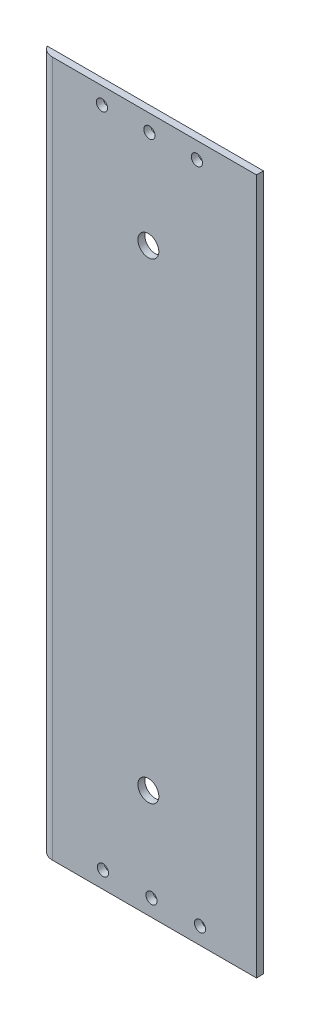
ISO-10303-21;
HEADER;
FILE_DESCRIPTION(('STEP AP214'),'2;1');
FILE_NAME('part.step','',(''),(''),'','','');
FILE_SCHEMA(('AUTOMOTIVE_DESIGN { 1 0 10303 214 1 1 1 1 }'));
ENDSEC;
DATA;
#1=APPLICATION_CONTEXT('core data for automotive mechanical design processes');
#2=APPLICATION_PROTOCOL_DEFINITION('international standard','automotive_design',2000,#1);
#3=PRODUCT_CONTEXT('',#1,'mechanical');
#4=PRODUCT('Part','Part','',(#3));
#5=PRODUCT_RELATED_PRODUCT_CATEGORY('part','',(#4));
#6=PRODUCT_DEFINITION_FORMATION('','',#4);
#7=PRODUCT_DEFINITION_CONTEXT('part definition',#1,'design');
#8=PRODUCT_DEFINITION('design','',#6,#7);
#9=PRODUCT_DEFINITION_SHAPE('','',#8);
#10=(LENGTH_UNIT() NAMED_UNIT(*) SI_UNIT(.MILLI.,.METRE.));
#11=(NAMED_UNIT(*) PLANE_ANGLE_UNIT() SI_UNIT($,.RADIAN.));
#12=(NAMED_UNIT(*) SI_UNIT($,.STERADIAN.) SOLID_ANGLE_UNIT());
#13=UNCERTAINTY_MEASURE_WITH_UNIT(LENGTH_MEASURE(1.E-05),#10,'distance_accuracy_value','');
#14=(GEOMETRIC_REPRESENTATION_CONTEXT(3) GLOBAL_UNCERTAINTY_ASSIGNED_CONTEXT((#13)) GLOBAL_UNIT_ASSIGNED_CONTEXT((#10,
#11,#12)) REPRESENTATION_CONTEXT('',''));
#15=CARTESIAN_POINT('',(0.,0.,0.));
#16=DIRECTION('',(0.,0.,1.));
#17=DIRECTION('',(1.,0.,0.));
#18=AXIS2_PLACEMENT_3D('',#15,#16,#17);
#19=CARTESIAN_POINT('',(-155.,-445.030563372544,5.));
#20=DIRECTION('',(0.,1.,0.));
#21=DIRECTION('',(0.,0.,1.));
#22=AXIS2_PLACEMENT_3D('',#19,#20,#21);
#23=PLANE('',#22);
#24=DIRECTION('',(1.,0.,0.));
#25=VECTOR('',#24,1.);
#26=CARTESIAN_POINT('',(-155.,-445.030563372544,5.));
#27=LINE('',#26,#25);
#28=CARTESIAN_POINT('',(-146.339745962156,-445.030563372544,5.));
#29=VERTEX_POINT('',#28);
#30=CARTESIAN_POINT('',(0.,-445.030563372544,5.));
#31=VERTEX_POINT('',#30);
#32=EDGE_CURVE('E75',#29,#31,#27,.T.);
#33=ORIENTED_EDGE('',*,*,#32,.F.);
#34=CARTESIAN_POINT('',(-146.339745962156,-445.030563372544,-5.));
#35=DIRECTION('',(0.,1.,0.));
#36=DIRECTION('',(0.,0.,1.));
#37=AXIS2_PLACEMENT_3D('',#34,#35,#36);
#38=CIRCLE('',#37,10.);
#39=CARTESIAN_POINT('',(-155.,-445.030563372544,0.));
#40=VERTEX_POINT('',#39);
#41=EDGE_CURVE('E44',#29,#40,#38,.F.);
#42=ORIENTED_EDGE('',*,*,#41,.T.);
#43=DIRECTION('',(1.,0.,0.));
#44=VECTOR('',#43,1.);
#45=CARTESIAN_POINT('',(-155.,-445.030563372544,0.));
#46=LINE('',#45,#44);
#47=CARTESIAN_POINT('',(0.,-445.030563372544,0.));
#48=VERTEX_POINT('',#47);
#49=EDGE_CURVE('E88',#40,#48,#46,.T.);
#50=ORIENTED_EDGE('',*,*,#49,.T.);
#51=DIRECTION('',(0.,0.,-1.));
#52=VECTOR('',#51,1.);
#53=CARTESIAN_POINT('',(0.,-445.030563372544,5.));
#54=LINE('',#53,#52);
#55=EDGE_CURVE('E86',#31,#48,#54,.T.);
#56=ORIENTED_EDGE('',*,*,#55,.F.);
#57=EDGE_LOOP('',(#33,#42,#50,#56));
#58=FACE_BOUND('',#57,.T.);
#59=ADVANCED_FACE('F36',(#58),#23,.F.);
#60=CARTESIAN_POINT('',(0.,-445.030563372544,5.));
#61=DIRECTION('',(-1.,0.,0.));
#62=DIRECTION('',(0.,-1.,0.));
#63=AXIS2_PLACEMENT_3D('',#60,#61,#62);
#64=PLANE('',#63);
#65=DIRECTION('',(0.,1.,0.));
#66=VECTOR('',#65,1.);
#67=CARTESIAN_POINT('',(0.,-445.030563372544,0.));
#68=LINE('',#67,#66);
#69=CARTESIAN_POINT('',(0.,53.496236627456,0.));
#70=VERTEX_POINT('',#69);
#71=EDGE_CURVE('E104',#48,#70,#68,.T.);
#72=ORIENTED_EDGE('',*,*,#71,.T.);
#73=DIRECTION('',(0.,0.,-1.));
#74=VECTOR('',#73,1.);
#75=CARTESIAN_POINT('',(0.,53.496236627456,5.));
#76=LINE('',#75,#74);
#77=CARTESIAN_POINT('',(0.,53.496236627456,5.));
#78=VERTEX_POINT('',#77);
#79=EDGE_CURVE('E91',#78,#70,#76,.T.);
#80=ORIENTED_EDGE('',*,*,#79,.F.);
#81=DIRECTION('',(0.,1.,0.));
#82=VECTOR('',#81,1.);
#83=CARTESIAN_POINT('',(0.,-445.030563372544,5.));
#84=LINE('',#83,#82);
#85=EDGE_CURVE('E79',#31,#78,#84,.T.);
#86=ORIENTED_EDGE('',*,*,#85,.F.);
#87=ORIENTED_EDGE('',*,*,#55,.T.);
#88=EDGE_LOOP('',(#72,#80,#86,#87));
#89=FACE_BOUND('',#88,.T.);
#90=ADVANCED_FACE('F93',(#89),#64,.F.);
#91=CARTESIAN_POINT('',(-155.,53.496236627456,5.));
#92=DIRECTION('',(0.,-1.,0.));
#93=DIRECTION('',(0.,0.,-1.));
#94=AXIS2_PLACEMENT_3D('',#91,#92,#93);
#95=PLANE('',#94);
#96=DIRECTION('',(-1.,0.,0.));
#97=VECTOR('',#96,1.);
#98=CARTESIAN_POINT('',(-155.,53.496236627456,0.));
#99=LINE('',#98,#97);
#100=CARTESIAN_POINT('',(-155.,53.496236627456,0.));
#101=VERTEX_POINT('',#100);
#102=EDGE_CURVE('E83',#70,#101,#99,.T.);
#103=ORIENTED_EDGE('',*,*,#102,.T.);
#104=CARTESIAN_POINT('',(-146.339745962156,53.496236627456,-5.));
#105=DIRECTION('',(0.,-1.,0.));
#106=DIRECTION('',(0.,0.,-1.));
#107=AXIS2_PLACEMENT_3D('',#104,#105,#106);
#108=CIRCLE('',#107,10.);
#109=CARTESIAN_POINT('',(-146.339745962156,53.496236627456,5.));
#110=VERTEX_POINT('',#109);
#111=EDGE_CURVE('E12',#101,#110,#108,.F.);
#112=ORIENTED_EDGE('',*,*,#111,.T.);
#113=DIRECTION('',(-1.,0.,0.));
#114=VECTOR('',#113,1.);
#115=CARTESIAN_POINT('',(-155.,53.496236627456,5.));
#116=LINE('',#115,#114);
#117=EDGE_CURVE('E95',#78,#110,#116,.T.);
#118=ORIENTED_EDGE('',*,*,#117,.F.);
#119=ORIENTED_EDGE('',*,*,#79,.T.);
#120=EDGE_LOOP('',(#103,#112,#118,#119));
#121=FACE_BOUND('',#120,.T.);
#122=ADVANCED_FACE('F124',(#121),#95,.F.);
#123=CARTESIAN_POINT('',(0.,0.,5.));
#124=DIRECTION('',(0.,0.,-1.));
#125=DIRECTION('',(-1.,0.,0.));
#126=AXIS2_PLACEMENT_3D('',#123,#124,#125);
#127=PLANE('',#126);
#128=CARTESIAN_POINT('',(-110.784394877579,41.4712366274554,5.));
#129=DIRECTION('',(0.,0.,1.));
#130=DIRECTION('',(1.,0.,0.));
#131=AXIS2_PLACEMENT_3D('',#128,#129,#130);
#132=CIRCLE('',#131,4.00000000000001);
#133=CARTESIAN_POINT('',(-106.784394877579,41.4712366274554,5.));
#134=VERTEX_POINT('',#133);
#135=EDGE_CURVE('E196',#134,#134,#132,.T.);
#136=ORIENTED_EDGE('',*,*,#135,.F.);
#137=EDGE_LOOP('',(#136));
#138=FACE_BOUND('',#137,.T.);
#139=CARTESIAN_POINT('',(-76.7483948775787,41.4712366274555,5.));
#140=DIRECTION('',(0.,0.,1.));
#141=DIRECTION('',(1.,0.,0.));
#142=AXIS2_PLACEMENT_3D('',#139,#140,#141);
#143=CIRCLE('',#142,4.00000000000001);
#144=CARTESIAN_POINT('',(-72.7483948775787,41.4712366274555,5.));
#145=VERTEX_POINT('',#144);
#146=EDGE_CURVE('E190',#145,#145,#143,.T.);
#147=ORIENTED_EDGE('',*,*,#146,.F.);
#148=EDGE_LOOP('',(#147));
#149=FACE_BOUND('',#148,.T.);
#150=CARTESIAN_POINT('',(-42.7123948775787,41.4712366274555,5.));
#151=DIRECTION('',(0.,0.,1.));
#152=DIRECTION('',(1.,0.,0.));
#153=AXIS2_PLACEMENT_3D('',#150,#151,#152);
#154=CIRCLE('',#153,4.);
#155=CARTESIAN_POINT('',(-38.7123948775787,41.4712366274555,5.));
#156=VERTEX_POINT('',#155);
#157=EDGE_CURVE('E184',#156,#156,#154,.T.);
#158=ORIENTED_EDGE('',*,*,#157,.F.);
#159=EDGE_LOOP('',(#158));
#160=FACE_BOUND('',#159,.T.);
#161=CARTESIAN_POINT('',(-40.4743948775786,-433.005563372545,5.));
#162=DIRECTION('',(0.,0.,1.));
#163=DIRECTION('',(1.,0.,0.));
#164=AXIS2_PLACEMENT_3D('',#161,#162,#163);
#165=CIRCLE('',#164,4.);
#166=CARTESIAN_POINT('',(-36.4743948775786,-433.005563372545,5.));
#167=VERTEX_POINT('',#166);
#168=EDGE_CURVE('E176',#167,#167,#165,.T.);
#169=ORIENTED_EDGE('',*,*,#168,.F.);
#170=EDGE_LOOP('',(#169));
#171=FACE_BOUND('',#170,.T.);
#172=CARTESIAN_POINT('',(-75.2723948775786,-433.005563372544,5.));
#173=DIRECTION('',(0.,0.,1.));
#174=DIRECTION('',(1.,0.,0.));
#175=AXIS2_PLACEMENT_3D('',#172,#173,#174);
#176=CIRCLE('',#175,4.00000000000001);
#177=CARTESIAN_POINT('',(-71.2723948775786,-433.005563372544,5.));
#178=VERTEX_POINT('',#177);
#179=EDGE_CURVE('E169',#178,#178,#176,.T.);
#180=ORIENTED_EDGE('',*,*,#179,.F.);
#181=EDGE_LOOP('',(#180));
#182=FACE_BOUND('',#181,.T.);
#183=CARTESIAN_POINT('',(-110.070394877579,-433.005563372544,5.));
#184=DIRECTION('',(0.,0.,1.));
#185=DIRECTION('',(1.,0.,0.));
#186=AXIS2_PLACEMENT_3D('',#183,#184,#185);
#187=CIRCLE('',#186,4.00000000000001);
#188=CARTESIAN_POINT('',(-106.070394877579,-433.005563372544,5.));
#189=VERTEX_POINT('',#188);
#190=EDGE_CURVE('E174',#189,#189,#187,.T.);
#191=ORIENTED_EDGE('',*,*,#190,.F.);
#192=EDGE_LOOP('',(#191));
#193=FACE_BOUND('',#192,.T.);
#194=CARTESIAN_POINT('',(-77.5000000000002,-367.367664241042,5.));
#195=DIRECTION('',(0.,0.,1.));
#196=DIRECTION('',(1.,0.,0.));
#197=AXIS2_PLACEMENT_3D('',#194,#195,#196);
#198=CIRCLE('',#197,7.50000000000001);
#199=CARTESIAN_POINT('',(-70.0000000000002,-367.367664241042,5.));
#200=VERTEX_POINT('',#199);
#201=EDGE_CURVE('E102',#200,#200,#198,.T.);
#202=ORIENTED_EDGE('',*,*,#201,.F.);
#203=EDGE_LOOP('',(#202));
#204=FACE_BOUND('',#203,.T.);
#205=CARTESIAN_POINT('',(-77.5000000000002,-29.1666625040467,5.));
#206=DIRECTION('',(0.,0.,1.));
#207=DIRECTION('',(1.,0.,0.));
#208=AXIS2_PLACEMENT_3D('',#205,#206,#207);
#209=CIRCLE('',#208,7.50000000000001);
#210=CARTESIAN_POINT('',(-70.0000000000002,-29.1666625040467,5.));
#211=VERTEX_POINT('',#210);
#212=EDGE_CURVE('E210',#211,#211,#209,.T.);
#213=ORIENTED_EDGE('',*,*,#212,.F.);
#214=EDGE_LOOP('',(#213));
#215=FACE_BOUND('',#214,.T.);
#216=ORIENTED_EDGE('',*,*,#117,.T.);
#217=DIRECTION('',(0.,1.,0.));
#218=VECTOR('',#217,1.);
#219=CARTESIAN_POINT('',(-146.339745962156,0.,5.));
#220=LINE('',#219,#218);
#221=EDGE_CURVE('E81',#110,#29,#220,.F.);
#222=ORIENTED_EDGE('',*,*,#221,.T.);
#223=ORIENTED_EDGE('',*,*,#32,.T.);
#224=ORIENTED_EDGE('',*,*,#85,.T.);
#225=EDGE_LOOP('',(#216,#222,#223,#224));
#226=FACE_BOUND('',#225,.T.);
#227=ADVANCED_FACE('F77',(#138,#149,#160,#171,#182,#193,#204,#215,#226),#127,.F.);
#228=CARTESIAN_POINT('',(0.,0.,0.));
#229=DIRECTION('',(0.,0.,-1.));
#230=DIRECTION('',(-1.,0.,0.));
#231=AXIS2_PLACEMENT_3D('',#228,#229,#230);
#232=PLANE('',#231);
#233=CARTESIAN_POINT('',(-110.784394877579,41.4712366274554,0.));
#234=DIRECTION('',(0.,0.,-1.));
#235=DIRECTION('',(-1.,0.,0.));
#236=AXIS2_PLACEMENT_3D('',#233,#234,#235);
#237=CIRCLE('',#236,4.00000000000001);
#238=CARTESIAN_POINT('',(-114.784394877579,41.4712366274554,0.));
#239=VERTEX_POINT('',#238);
#240=EDGE_CURVE('E199',#239,#239,#237,.F.);
#241=ORIENTED_EDGE('',*,*,#240,.T.);
#242=EDGE_LOOP('',(#241));
#243=FACE_BOUND('',#242,.T.);
#244=CARTESIAN_POINT('',(-76.7483948775787,41.4712366274555,0.));
#245=DIRECTION('',(0.,0.,-1.));
#246=DIRECTION('',(-1.,0.,0.));
#247=AXIS2_PLACEMENT_3D('',#244,#245,#246);
#248=CIRCLE('',#247,4.00000000000001);
#249=CARTESIAN_POINT('',(-80.7483948775787,41.4712366274555,0.));
#250=VERTEX_POINT('',#249);
#251=EDGE_CURVE('E193',#250,#250,#248,.F.);
#252=ORIENTED_EDGE('',*,*,#251,.T.);
#253=EDGE_LOOP('',(#252));
#254=FACE_BOUND('',#253,.T.);
#255=CARTESIAN_POINT('',(-42.7123948775787,41.4712366274555,0.));
#256=DIRECTION('',(0.,0.,-1.));
#257=DIRECTION('',(-1.,0.,0.));
#258=AXIS2_PLACEMENT_3D('',#255,#256,#257);
#259=CIRCLE('',#258,4.);
#260=CARTESIAN_POINT('',(-46.7123948775787,41.4712366274555,0.));
#261=VERTEX_POINT('',#260);
#262=EDGE_CURVE('E187',#261,#261,#259,.F.);
#263=ORIENTED_EDGE('',*,*,#262,.T.);
#264=EDGE_LOOP('',(#263));
#265=FACE_BOUND('',#264,.T.);
#266=CARTESIAN_POINT('',(-40.4743948775786,-433.005563372545,0.));
#267=DIRECTION('',(0.,0.,-1.));
#268=DIRECTION('',(-1.,0.,0.));
#269=AXIS2_PLACEMENT_3D('',#266,#267,#268);
#270=CIRCLE('',#269,4.);
#271=CARTESIAN_POINT('',(-44.4743948775786,-433.005563372545,0.));
#272=VERTEX_POINT('',#271);
#273=EDGE_CURVE('E181',#272,#272,#270,.F.);
#274=ORIENTED_EDGE('',*,*,#273,.T.);
#275=EDGE_LOOP('',(#274));
#276=FACE_BOUND('',#275,.T.);
#277=CARTESIAN_POINT('',(-75.2723948775786,-433.005563372544,0.));
#278=DIRECTION('',(0.,0.,-1.));
#279=DIRECTION('',(-1.,0.,0.));
#280=AXIS2_PLACEMENT_3D('',#277,#278,#279);
#281=CIRCLE('',#280,4.00000000000001);
#282=CARTESIAN_POINT('',(-79.2723948775786,-433.005563372544,0.));
#283=VERTEX_POINT('',#282);
#284=EDGE_CURVE('E166',#283,#283,#281,.F.);
#285=ORIENTED_EDGE('',*,*,#284,.T.);
#286=EDGE_LOOP('',(#285));
#287=FACE_BOUND('',#286,.T.);
#288=CARTESIAN_POINT('',(-110.070394877579,-433.005563372544,0.));
#289=DIRECTION('',(0.,0.,-1.));
#290=DIRECTION('',(-1.,0.,0.));
#291=AXIS2_PLACEMENT_3D('',#288,#289,#290);
#292=CIRCLE('',#291,4.00000000000001);
#293=CARTESIAN_POINT('',(-114.070394877579,-433.005563372544,0.));
#294=VERTEX_POINT('',#293);
#295=EDGE_CURVE('E171',#294,#294,#292,.F.);
#296=ORIENTED_EDGE('',*,*,#295,.T.);
#297=EDGE_LOOP('',(#296));
#298=FACE_BOUND('',#297,.T.);
#299=CARTESIAN_POINT('',(-77.5000000000002,-367.367664241042,0.));
#300=DIRECTION('',(0.,0.,-1.));
#301=DIRECTION('',(-1.,0.,0.));
#302=AXIS2_PLACEMENT_3D('',#299,#300,#301);
#303=CIRCLE('',#302,7.50000000000001);
#304=CARTESIAN_POINT('',(-85.0000000000002,-367.367664241042,0.));
#305=VERTEX_POINT('',#304);
#306=EDGE_CURVE('E207',#305,#305,#303,.F.);
#307=ORIENTED_EDGE('',*,*,#306,.T.);
#308=EDGE_LOOP('',(#307));
#309=FACE_BOUND('',#308,.T.);
#310=CARTESIAN_POINT('',(-77.5000000000002,-29.1666625040467,0.));
#311=DIRECTION('',(0.,0.,-1.));
#312=DIRECTION('',(-1.,0.,0.));
#313=AXIS2_PLACEMENT_3D('',#310,#311,#312);
#314=CIRCLE('',#313,7.50000000000001);
#315=CARTESIAN_POINT('',(-85.0000000000002,-29.1666625040467,0.));
#316=VERTEX_POINT('',#315);
#317=EDGE_CURVE('E203',#316,#316,#314,.F.);
#318=ORIENTED_EDGE('',*,*,#317,.T.);
#319=EDGE_LOOP('',(#318));
#320=FACE_BOUND('',#319,.T.);
#321=DIRECTION('',(0.,-1.,0.));
#322=VECTOR('',#321,1.);
#323=CARTESIAN_POINT('',(-155.,-445.030563372544,0.));
#324=LINE('',#323,#322);
#325=EDGE_CURVE('E100',#101,#40,#324,.T.);
#326=ORIENTED_EDGE('',*,*,#325,.F.);
#327=ORIENTED_EDGE('',*,*,#102,.F.);
#328=ORIENTED_EDGE('',*,*,#71,.F.);
#329=ORIENTED_EDGE('',*,*,#49,.F.);
#330=EDGE_LOOP('',(#326,#327,#328,#329));
#331=FACE_BOUND('',#330,.T.);
#332=ADVANCED_FACE('F110',(#243,#254,#265,#276,#287,#298,#309,#320,#331),#232,.T.);
#333=CARTESIAN_POINT('',(-77.5000000000002,-29.1666625040467,-0.00100000000000013));
#334=DIRECTION('',(0.,0.,1.));
#335=DIRECTION('',(1.,0.,0.));
#336=AXIS2_PLACEMENT_3D('',#333,#334,#335);
#337=CYLINDRICAL_SURFACE('',#336,7.50000000000001);
#338=ORIENTED_EDGE('',*,*,#317,.F.);
#339=EDGE_LOOP('',(#338));
#340=FACE_BOUND('',#339,.T.);
#341=ORIENTED_EDGE('',*,*,#212,.T.);
#342=EDGE_LOOP('',(#341));
#343=FACE_BOUND('',#342,.T.);
#344=ADVANCED_FACE('F131',(#340,#343),#337,.F.);
#345=CARTESIAN_POINT('',(-77.5000000000002,-367.367664241042,-0.00100000000000013));
#346=DIRECTION('',(0.,0.,1.));
#347=DIRECTION('',(1.,0.,0.));
#348=AXIS2_PLACEMENT_3D('',#345,#346,#347);
#349=CYLINDRICAL_SURFACE('',#348,7.50000000000001);
#350=ORIENTED_EDGE('',*,*,#306,.F.);
#351=EDGE_LOOP('',(#350));
#352=FACE_BOUND('',#351,.T.);
#353=ORIENTED_EDGE('',*,*,#201,.T.);
#354=EDGE_LOOP('',(#353));
#355=FACE_BOUND('',#354,.T.);
#356=ADVANCED_FACE('F138',(#352,#355),#349,.F.);
#357=CARTESIAN_POINT('',(-110.070394877579,-433.005563372544,-0.00100000000000013));
#358=DIRECTION('',(0.,0.,1.));
#359=DIRECTION('',(1.,0.,0.));
#360=AXIS2_PLACEMENT_3D('',#357,#358,#359);
#361=CYLINDRICAL_SURFACE('',#360,4.00000000000001);
#362=ORIENTED_EDGE('',*,*,#295,.F.);
#363=EDGE_LOOP('',(#362));
#364=FACE_BOUND('',#363,.T.);
#365=ORIENTED_EDGE('',*,*,#190,.T.);
#366=EDGE_LOOP('',(#365));
#367=FACE_BOUND('',#366,.T.);
#368=ADVANCED_FACE('F142',(#364,#367),#361,.F.);
#369=CARTESIAN_POINT('',(-75.2723948775786,-433.005563372544,-0.00100000000000013));
#370=DIRECTION('',(0.,0.,1.));
#371=DIRECTION('',(1.,0.,0.));
#372=AXIS2_PLACEMENT_3D('',#369,#370,#371);
#373=CYLINDRICAL_SURFACE('',#372,4.00000000000001);
#374=ORIENTED_EDGE('',*,*,#284,.F.);
#375=EDGE_LOOP('',(#374));
#376=FACE_BOUND('',#375,.T.);
#377=ORIENTED_EDGE('',*,*,#179,.T.);
#378=EDGE_LOOP('',(#377));
#379=FACE_BOUND('',#378,.T.);
#380=ADVANCED_FACE('F145',(#376,#379),#373,.F.);
#381=CARTESIAN_POINT('',(-40.4743948775786,-433.005563372545,-0.00100000000000013));
#382=DIRECTION('',(0.,0.,1.));
#383=DIRECTION('',(1.,0.,0.));
#384=AXIS2_PLACEMENT_3D('',#381,#382,#383);
#385=CYLINDRICAL_SURFACE('',#384,4.);
#386=ORIENTED_EDGE('',*,*,#273,.F.);
#387=EDGE_LOOP('',(#386));
#388=FACE_BOUND('',#387,.T.);
#389=ORIENTED_EDGE('',*,*,#168,.T.);
#390=EDGE_LOOP('',(#389));
#391=FACE_BOUND('',#390,.T.);
#392=ADVANCED_FACE('F154',(#388,#391),#385,.F.);
#393=CARTESIAN_POINT('',(-42.7123948775787,41.4712366274555,-0.00100000000000013));
#394=DIRECTION('',(0.,0.,1.));
#395=DIRECTION('',(1.,0.,0.));
#396=AXIS2_PLACEMENT_3D('',#393,#394,#395);
#397=CYLINDRICAL_SURFACE('',#396,4.);
#398=ORIENTED_EDGE('',*,*,#262,.F.);
#399=EDGE_LOOP('',(#398));
#400=FACE_BOUND('',#399,.T.);
#401=ORIENTED_EDGE('',*,*,#157,.T.);
#402=EDGE_LOOP('',(#401));
#403=FACE_BOUND('',#402,.T.);
#404=ADVANCED_FACE('F150',(#400,#403),#397,.F.);
#405=CARTESIAN_POINT('',(-76.7483948775787,41.4712366274555,-0.00100000000000013));
#406=DIRECTION('',(0.,0.,1.));
#407=DIRECTION('',(1.,0.,0.));
#408=AXIS2_PLACEMENT_3D('',#405,#406,#407);
#409=CYLINDRICAL_SURFACE('',#408,4.00000000000001);
#410=ORIENTED_EDGE('',*,*,#251,.F.);
#411=EDGE_LOOP('',(#410));
#412=FACE_BOUND('',#411,.T.);
#413=ORIENTED_EDGE('',*,*,#146,.T.);
#414=EDGE_LOOP('',(#413));
#415=FACE_BOUND('',#414,.T.);
#416=ADVANCED_FACE('F117',(#412,#415),#409,.F.);
#417=CARTESIAN_POINT('',(-110.784394877579,41.4712366274554,-0.00100000000000013));
#418=DIRECTION('',(0.,0.,1.));
#419=DIRECTION('',(1.,0.,0.));
#420=AXIS2_PLACEMENT_3D('',#417,#418,#419);
#421=CYLINDRICAL_SURFACE('',#420,4.00000000000001);
#422=ORIENTED_EDGE('',*,*,#240,.F.);
#423=EDGE_LOOP('',(#422));
#424=FACE_BOUND('',#423,.T.);
#425=ORIENTED_EDGE('',*,*,#135,.T.);
#426=EDGE_LOOP('',(#425));
#427=FACE_BOUND('',#426,.T.);
#428=ADVANCED_FACE('F113',(#424,#427),#421,.F.);
#429=CARTESIAN_POINT('',(-146.339745962156,-445.030563372544,-5.));
#430=DIRECTION('',(0.,1.,0.));
#431=DIRECTION('',(0.,0.,1.));
#432=AXIS2_PLACEMENT_3D('',#429,#430,#431);
#433=CYLINDRICAL_SURFACE('',#432,10.);
#434=ORIENTED_EDGE('',*,*,#111,.F.);
#435=ORIENTED_EDGE('',*,*,#325,.T.);
#436=ORIENTED_EDGE('',*,*,#41,.F.);
#437=ORIENTED_EDGE('',*,*,#221,.F.);
#438=EDGE_LOOP('',(#434,#435,#436,#437));
#439=FACE_BOUND('',#438,.T.);
#440=ADVANCED_FACE('F38',(#439),#433,.T.);
#441=CLOSED_SHELL('',(#59,#90,#122,#227,#332,#344,#356,#368,#380,#392,#404,#416,#428,#440));
#442=MANIFOLD_SOLID_BREP('B2',#441);
#443=ADVANCED_BREP_SHAPE_REPRESENTATION('',(#18,#442),#14);
#444=SHAPE_DEFINITION_REPRESENTATION(#9,#443);
ENDSEC;
END-ISO-10303-21;
